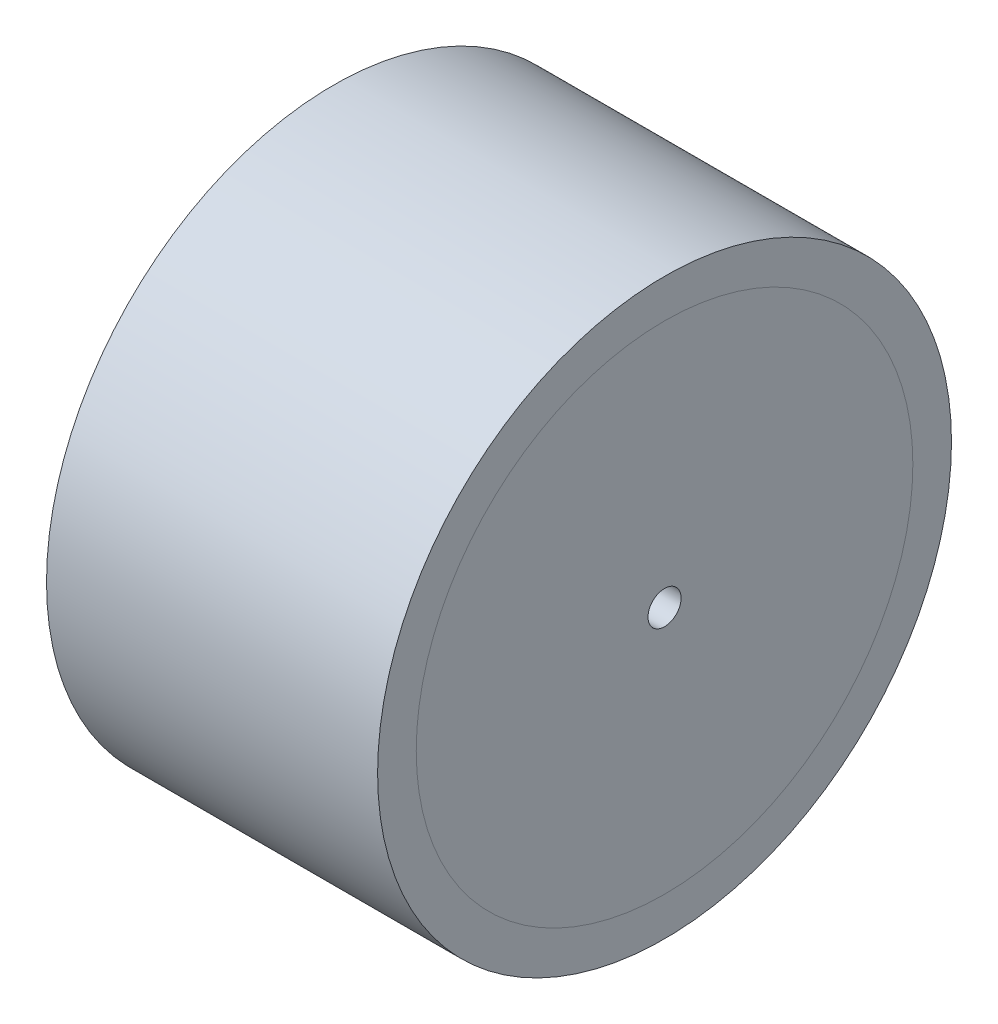
ISO-10303-21;
HEADER;
FILE_DESCRIPTION(('STEP AP214'),'2;1');
FILE_NAME('part.step','',(''),(''),'','','');
FILE_SCHEMA(('AUTOMOTIVE_DESIGN { 1 0 10303 214 1 1 1 1 }'));
ENDSEC;
DATA;
#1=APPLICATION_CONTEXT('core data for automotive mechanical design processes');
#2=APPLICATION_PROTOCOL_DEFINITION('international standard','automotive_design',2000,#1);
#3=PRODUCT_CONTEXT('',#1,'mechanical');
#4=PRODUCT('Part','Part','',(#3));
#5=PRODUCT_RELATED_PRODUCT_CATEGORY('part','',(#4));
#6=PRODUCT_DEFINITION_FORMATION('','',#4);
#7=PRODUCT_DEFINITION_CONTEXT('part definition',#1,'design');
#8=PRODUCT_DEFINITION('design','',#6,#7);
#9=PRODUCT_DEFINITION_SHAPE('','',#8);
#10=(LENGTH_UNIT() NAMED_UNIT(*) SI_UNIT(.MILLI.,.METRE.));
#11=(NAMED_UNIT(*) PLANE_ANGLE_UNIT() SI_UNIT($,.RADIAN.));
#12=(NAMED_UNIT(*) SI_UNIT($,.STERADIAN.) SOLID_ANGLE_UNIT());
#13=UNCERTAINTY_MEASURE_WITH_UNIT(LENGTH_MEASURE(1.E-05),#10,'distance_accuracy_value','');
#14=(GEOMETRIC_REPRESENTATION_CONTEXT(3) GLOBAL_UNCERTAINTY_ASSIGNED_CONTEXT((#13)) GLOBAL_UNIT_ASSIGNED_CONTEXT((#10,
#11,#12)) REPRESENTATION_CONTEXT('',''));
#15=CARTESIAN_POINT('',(0.,0.,0.));
#16=DIRECTION('',(0.,0.,1.));
#17=DIRECTION('',(1.,0.,0.));
#18=AXIS2_PLACEMENT_3D('',#15,#16,#17);
#19=CARTESIAN_POINT('',(0.,0.,0.));
#20=DIRECTION('',(1.,0.,0.));
#21=DIRECTION('',(0.,0.,-1.));
#22=AXIS2_PLACEMENT_3D('',#19,#20,#21);
#23=PLANE('',#22);
#24=CARTESIAN_POINT('',(0.,0.,0.));
#25=DIRECTION('',(1.,0.,0.));
#26=DIRECTION('',(0.,0.,-1.));
#27=AXIS2_PLACEMENT_3D('',#24,#25,#26);
#28=CIRCLE('',#27,26.);
#29=CARTESIAN_POINT('',(0.,0.,-26.));
#30=VERTEX_POINT('',#29);
#31=EDGE_CURVE('E64',#30,#30,#28,.T.);
#32=ORIENTED_EDGE('',*,*,#31,.F.);
#33=EDGE_LOOP('',(#32));
#34=FACE_BOUND('',#33,.T.);
#35=CARTESIAN_POINT('',(0.,0.,0.));
#36=DIRECTION('',(1.,0.,0.));
#37=DIRECTION('',(0.,0.,-1.));
#38=AXIS2_PLACEMENT_3D('',#35,#36,#37);
#39=CIRCLE('',#38,22.5);
#40=CARTESIAN_POINT('',(0.,0.,-22.5));
#41=VERTEX_POINT('',#40);
#42=EDGE_CURVE('E10',#41,#41,#39,.F.);
#43=ORIENTED_EDGE('',*,*,#42,.F.);
#44=EDGE_LOOP('',(#43));
#45=FACE_BOUND('',#44,.T.);
#46=ADVANCED_FACE('F47',(#34,#45),#23,.F.);
#47=CARTESIAN_POINT('',(30.,0.,0.));
#48=DIRECTION('',(1.,0.,0.));
#49=DIRECTION('',(0.,0.,-1.));
#50=AXIS2_PLACEMENT_3D('',#47,#48,#49);
#51=PLANE('',#50);
#52=CARTESIAN_POINT('',(30.,0.,0.));
#53=DIRECTION('',(1.,0.,0.));
#54=DIRECTION('',(0.,0.,-1.));
#55=AXIS2_PLACEMENT_3D('',#52,#53,#54);
#56=CIRCLE('',#55,26.);
#57=CARTESIAN_POINT('',(30.,0.,-26.));
#58=VERTEX_POINT('',#57);
#59=EDGE_CURVE('E62',#58,#58,#56,.T.);
#60=ORIENTED_EDGE('',*,*,#59,.T.);
#61=EDGE_LOOP('',(#60));
#62=FACE_BOUND('',#61,.T.);
#63=CARTESIAN_POINT('',(30.,0.,0.));
#64=DIRECTION('',(1.,0.,0.));
#65=DIRECTION('',(0.,0.,-1.));
#66=AXIS2_PLACEMENT_3D('',#63,#64,#65);
#67=CIRCLE('',#66,22.5);
#68=CARTESIAN_POINT('',(30.,0.,-22.5));
#69=VERTEX_POINT('',#68);
#70=EDGE_CURVE('E51',#69,#69,#67,.F.);
#71=ORIENTED_EDGE('',*,*,#70,.T.);
#72=EDGE_LOOP('',(#71));
#73=FACE_BOUND('',#72,.T.);
#74=ADVANCED_FACE('F91',(#62,#73),#51,.T.);
#75=CARTESIAN_POINT('',(30.,0.,0.));
#76=DIRECTION('',(-1.,0.,0.));
#77=DIRECTION('',(0.,0.,1.));
#78=AXIS2_PLACEMENT_3D('',#75,#76,#77);
#79=CYLINDRICAL_SURFACE('',#78,26.);
#80=ORIENTED_EDGE('',*,*,#59,.F.);
#81=EDGE_LOOP('',(#80));
#82=FACE_BOUND('',#81,.T.);
#83=ORIENTED_EDGE('',*,*,#31,.T.);
#84=EDGE_LOOP('',(#83));
#85=FACE_BOUND('',#84,.T.);
#86=ADVANCED_FACE('F49',(#82,#85),#79,.T.);
#87=CARTESIAN_POINT('',(30.,0.,0.));
#88=DIRECTION('',(-1.,0.,0.));
#89=DIRECTION('',(0.,0.,1.));
#90=AXIS2_PLACEMENT_3D('',#87,#88,#89);
#91=CIRCLE('',#90,1.5);
#92=CARTESIAN_POINT('',(30.,0.,1.5));
#93=VERTEX_POINT('',#92);
#94=EDGE_CURVE('E67',#93,#93,#91,.T.);
#95=ORIENTED_EDGE('',*,*,#94,.T.);
#96=EDGE_LOOP('',(#95));
#97=FACE_BOUND('',#96,.T.);
#98=ORIENTED_EDGE('',*,*,#70,.F.);
#99=EDGE_LOOP('',(#98));
#100=FACE_BOUND('',#99,.T.);
#101=ADVANCED_FACE('F76',(#97,#100),#51,.T.);
#102=CARTESIAN_POINT('',(0.,0.,0.));
#103=DIRECTION('',(-1.,0.,0.));
#104=DIRECTION('',(0.,0.,1.));
#105=AXIS2_PLACEMENT_3D('',#102,#103,#104);
#106=CIRCLE('',#105,1.5);
#107=CARTESIAN_POINT('',(0.,0.,1.5));
#108=VERTEX_POINT('',#107);
#109=EDGE_CURVE('E70',#108,#108,#106,.T.);
#110=ORIENTED_EDGE('',*,*,#109,.F.);
#111=EDGE_LOOP('',(#110));
#112=FACE_BOUND('',#111,.T.);
#113=ORIENTED_EDGE('',*,*,#42,.T.);
#114=EDGE_LOOP('',(#113));
#115=FACE_BOUND('',#114,.T.);
#116=ADVANCED_FACE('F82',(#112,#115),#23,.F.);
#117=CARTESIAN_POINT('',(30.,0.,0.));
#118=DIRECTION('',(-1.,0.,0.));
#119=DIRECTION('',(0.,0.,1.));
#120=AXIS2_PLACEMENT_3D('',#117,#118,#119);
#121=CYLINDRICAL_SURFACE('',#120,1.5);
#122=ORIENTED_EDGE('',*,*,#94,.F.);
#123=EDGE_LOOP('',(#122));
#124=FACE_BOUND('',#123,.T.);
#125=ORIENTED_EDGE('',*,*,#109,.T.);
#126=EDGE_LOOP('',(#125));
#127=FACE_BOUND('',#126,.T.);
#128=ADVANCED_FACE('F79',(#124,#127),#121,.F.);
#129=CLOSED_SHELL('',(#46,#74,#86,#101,#116,#128));
#130=MANIFOLD_SOLID_BREP('B2',#129);
#131=ADVANCED_BREP_SHAPE_REPRESENTATION('',(#18,#130),#14);
#132=SHAPE_DEFINITION_REPRESENTATION(#9,#131);
ENDSEC;
END-ISO-10303-21;
